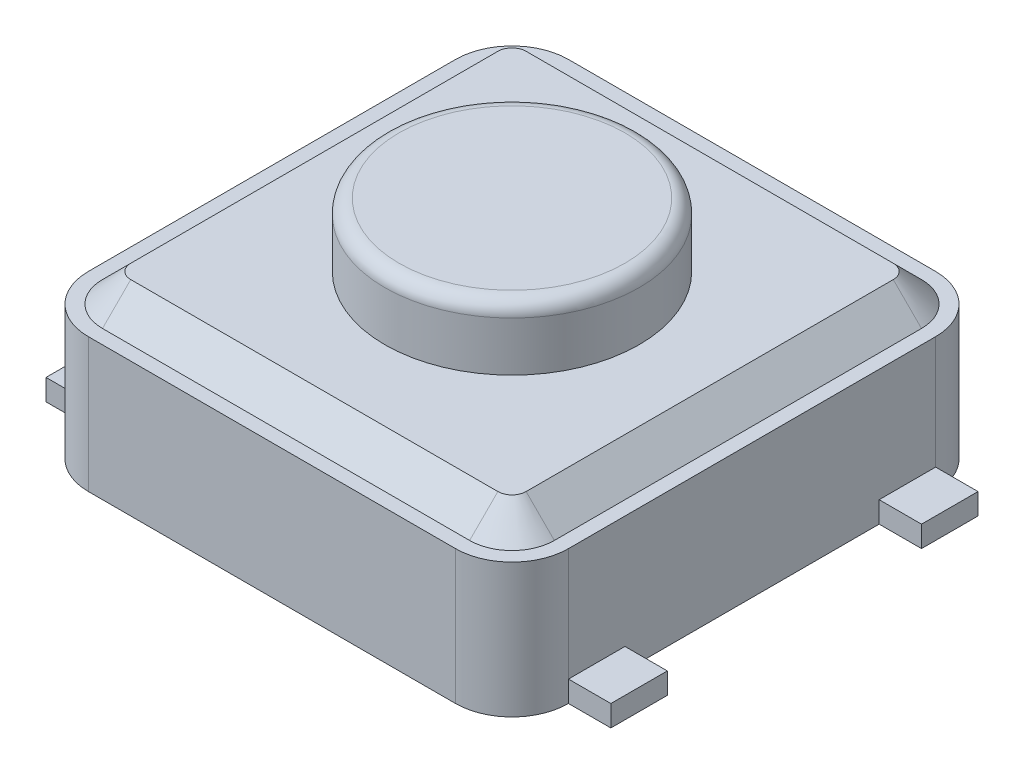
ISO-10303-21;
HEADER;
FILE_DESCRIPTION(('STEP AP214'),'2;1');
FILE_NAME('part.step','',(''),(''),'','','');
FILE_SCHEMA(('AUTOMOTIVE_DESIGN { 1 0 10303 214 1 1 1 1 }'));
ENDSEC;
DATA;
#1=APPLICATION_CONTEXT('core data for automotive mechanical design processes');
#2=APPLICATION_PROTOCOL_DEFINITION('international standard','automotive_design',2000,#1);
#3=PRODUCT_CONTEXT('',#1,'mechanical');
#4=PRODUCT('Part','Part','',(#3));
#5=PRODUCT_RELATED_PRODUCT_CATEGORY('part','',(#4));
#6=PRODUCT_DEFINITION_FORMATION('','',#4);
#7=PRODUCT_DEFINITION_CONTEXT('part definition',#1,'design');
#8=PRODUCT_DEFINITION('design','',#6,#7);
#9=PRODUCT_DEFINITION_SHAPE('','',#8);
#10=(LENGTH_UNIT() NAMED_UNIT(*) SI_UNIT(.MILLI.,.METRE.));
#11=(NAMED_UNIT(*) PLANE_ANGLE_UNIT() SI_UNIT($,.RADIAN.));
#12=(NAMED_UNIT(*) SI_UNIT($,.STERADIAN.) SOLID_ANGLE_UNIT());
#13=UNCERTAINTY_MEASURE_WITH_UNIT(LENGTH_MEASURE(1.E-05),#10,'distance_accuracy_value','');
#14=(GEOMETRIC_REPRESENTATION_CONTEXT(3) GLOBAL_UNCERTAINTY_ASSIGNED_CONTEXT((#13)) GLOBAL_UNIT_ASSIGNED_CONTEXT((#10,
#11,#12)) REPRESENTATION_CONTEXT('',''));
#15=CARTESIAN_POINT('',(0.,0.,0.));
#16=DIRECTION('',(0.,0.,1.));
#17=DIRECTION('',(1.,0.,0.));
#18=AXIS2_PLACEMENT_3D('',#15,#16,#17);
#19=CARTESIAN_POINT('',(-1.7,1.15,0.));
#20=DIRECTION('',(1.,0.,0.));
#21=DIRECTION('',(0.,0.,-1.));
#22=AXIS2_PLACEMENT_3D('',#19,#20,#21);
#23=PLANE('',#22);
#24=DIRECTION('',(0.,0.,1.));
#25=VECTOR('',#24,1.);
#26=CARTESIAN_POINT('',(-1.7,0.95,-1.7));
#27=LINE('',#26,#25);
#28=CARTESIAN_POINT('',(-1.7,0.95,-1.3));
#29=VERTEX_POINT('',#28);
#30=CARTESIAN_POINT('',(-1.7,0.95,1.3));
#31=VERTEX_POINT('',#30);
#32=EDGE_CURVE('E421',#29,#31,#27,.T.);
#33=ORIENTED_EDGE('',*,*,#32,.F.);
#34=DIRECTION('',(0.,-1.,0.));
#35=VECTOR('',#34,1.);
#36=CARTESIAN_POINT('',(-1.7,1.15,-1.3));
#37=LINE('',#36,#35);
#38=CARTESIAN_POINT('',(-1.7,0.15,-1.3));
#39=VERTEX_POINT('',#38);
#40=EDGE_CURVE('E466',#29,#39,#37,.T.);
#41=ORIENTED_EDGE('',*,*,#40,.T.);
#42=DIRECTION('',(0.,0.,1.));
#43=VECTOR('',#42,1.);
#44=CARTESIAN_POINT('',(-1.7,0.15,-0.9));
#45=LINE('',#44,#43);
#46=CARTESIAN_POINT('',(-1.7,0.15,-0.9));
#47=VERTEX_POINT('',#46);
#48=EDGE_CURVE('E429',#39,#47,#45,.T.);
#49=ORIENTED_EDGE('',*,*,#48,.T.);
#50=DIRECTION('',(0.,-1.,0.));
#51=VECTOR('',#50,1.);
#52=CARTESIAN_POINT('',(-1.7,0.15,-0.9));
#53=LINE('',#52,#51);
#54=CARTESIAN_POINT('',(-1.7,0.,-0.9));
#55=VERTEX_POINT('',#54);
#56=EDGE_CURVE('E442',#47,#55,#53,.T.);
#57=ORIENTED_EDGE('',*,*,#56,.T.);
#58=DIRECTION('',(0.,0.,1.));
#59=VECTOR('',#58,1.);
#60=CARTESIAN_POINT('',(-1.7,0.,0.));
#61=LINE('',#60,#59);
#62=CARTESIAN_POINT('',(-1.7,0.,0.9));
#63=VERTEX_POINT('',#62);
#64=EDGE_CURVE('E464',#55,#63,#61,.T.);
#65=ORIENTED_EDGE('',*,*,#64,.T.);
#66=DIRECTION('',(0.,-1.,0.));
#67=VECTOR('',#66,1.);
#68=CARTESIAN_POINT('',(-1.7,0.15,0.9));
#69=LINE('',#68,#67);
#70=CARTESIAN_POINT('',(-1.7,0.15,0.9));
#71=VERTEX_POINT('',#70);
#72=EDGE_CURVE('E317',#71,#63,#69,.T.);
#73=ORIENTED_EDGE('',*,*,#72,.F.);
#74=DIRECTION('',(0.,0.,-1.));
#75=VECTOR('',#74,1.);
#76=CARTESIAN_POINT('',(-1.7,0.15,0.9));
#77=LINE('',#76,#75);
#78=CARTESIAN_POINT('',(-1.7,0.15,1.3));
#79=VERTEX_POINT('',#78);
#80=EDGE_CURVE('E307',#79,#71,#77,.T.);
#81=ORIENTED_EDGE('',*,*,#80,.F.);
#82=DIRECTION('',(0.,-1.,0.));
#83=VECTOR('',#82,1.);
#84=CARTESIAN_POINT('',(-1.7,1.15,1.3));
#85=LINE('',#84,#83);
#86=EDGE_CURVE('E336',#31,#79,#85,.T.);
#87=ORIENTED_EDGE('',*,*,#86,.F.);
#88=EDGE_LOOP('',(#33,#41,#49,#57,#65,#73,#81,#87));
#89=FACE_BOUND('',#88,.T.);
#90=ADVANCED_FACE('F38',(#89),#23,.F.);
#91=CARTESIAN_POINT('',(0.,1.15,-1.7));
#92=DIRECTION('',(0.,0.,1.));
#93=DIRECTION('',(1.,0.,0.));
#94=AXIS2_PLACEMENT_3D('',#91,#92,#93);
#95=PLANE('',#94);
#96=DIRECTION('',(-1.,0.,0.));
#97=VECTOR('',#96,1.);
#98=CARTESIAN_POINT('',(0.,0.,-1.7));
#99=LINE('',#98,#97);
#100=CARTESIAN_POINT('',(1.3,0.,-1.7));
#101=VERTEX_POINT('',#100);
#102=CARTESIAN_POINT('',(-1.3,0.,-1.7));
#103=VERTEX_POINT('',#102);
#104=EDGE_CURVE('E461',#101,#103,#99,.T.);
#105=ORIENTED_EDGE('',*,*,#104,.T.);
#106=DIRECTION('',(0.,-1.,0.));
#107=VECTOR('',#106,1.);
#108=CARTESIAN_POINT('',(-1.3,1.15,-1.7));
#109=LINE('',#108,#107);
#110=CARTESIAN_POINT('',(-1.3,0.95,-1.7));
#111=VERTEX_POINT('',#110);
#112=EDGE_CURVE('E471',#103,#111,#109,.F.);
#113=ORIENTED_EDGE('',*,*,#112,.T.);
#114=DIRECTION('',(-1.,0.,0.));
#115=VECTOR('',#114,1.);
#116=CARTESIAN_POINT('',(0.,0.95,-1.7));
#117=LINE('',#116,#115);
#118=CARTESIAN_POINT('',(1.3,0.95,-1.7));
#119=VERTEX_POINT('',#118);
#120=EDGE_CURVE('E418',#119,#111,#117,.T.);
#121=ORIENTED_EDGE('',*,*,#120,.F.);
#122=DIRECTION('',(0.,-1.,0.));
#123=VECTOR('',#122,1.);
#124=CARTESIAN_POINT('',(1.3,1.15,-1.7));
#125=LINE('',#124,#123);
#126=EDGE_CURVE('E401',#101,#119,#125,.F.);
#127=ORIENTED_EDGE('',*,*,#126,.F.);
#128=EDGE_LOOP('',(#105,#113,#121,#127));
#129=FACE_BOUND('',#128,.T.);
#130=ADVANCED_FACE('F502',(#129),#95,.F.);
#131=CARTESIAN_POINT('',(0.,1.15,0.));
#132=DIRECTION('',(0.,1.,0.));
#133=DIRECTION('',(0.,0.,1.));
#134=AXIS2_PLACEMENT_3D('',#131,#132,#133);
#135=PLANE('',#134);
#136=CARTESIAN_POINT('',(0.,1.15,0.));
#137=DIRECTION('',(0.,1.,0.));
#138=DIRECTION('',(0.,0.,1.));
#139=AXIS2_PLACEMENT_3D('',#136,#137,#138);
#140=CIRCLE('',#139,0.9);
#141=CARTESIAN_POINT('',(0.,1.15,0.9));
#142=VERTEX_POINT('',#141);
#143=EDGE_CURVE('E452',#142,#142,#140,.T.);
#144=ORIENTED_EDGE('',*,*,#143,.F.);
#145=EDGE_LOOP('',(#144));
#146=FACE_BOUND('',#145,.T.);
#147=DIRECTION('',(1.,0.,0.));
#148=VECTOR('',#147,1.);
#149=CARTESIAN_POINT('',(0.,1.15,-1.4));
#150=LINE('',#149,#148);
#151=CARTESIAN_POINT('',(-1.3,1.15,-1.4));
#152=VERTEX_POINT('',#151);
#153=CARTESIAN_POINT('',(1.3,1.15,-1.4));
#154=VERTEX_POINT('',#153);
#155=EDGE_CURVE('E422',#152,#154,#150,.T.);
#156=ORIENTED_EDGE('',*,*,#155,.F.);
#157=CARTESIAN_POINT('',(-1.3,1.15,-1.3));
#158=DIRECTION('',(0.,1.,0.));
#159=DIRECTION('',(0.,0.,1.));
#160=AXIS2_PLACEMENT_3D('',#157,#158,#159);
#161=CIRCLE('',#160,0.1);
#162=CARTESIAN_POINT('',(-1.4,1.15,-1.3));
#163=VERTEX_POINT('',#162);
#164=EDGE_CURVE('E475',#152,#163,#161,.T.);
#165=ORIENTED_EDGE('',*,*,#164,.T.);
#166=DIRECTION('',(0.,0.,-1.));
#167=VECTOR('',#166,1.);
#168=CARTESIAN_POINT('',(-1.4,1.15,-1.4));
#169=LINE('',#168,#167);
#170=CARTESIAN_POINT('',(-1.4,1.15,1.3));
#171=VERTEX_POINT('',#170);
#172=EDGE_CURVE('E425',#171,#163,#169,.T.);
#173=ORIENTED_EDGE('',*,*,#172,.F.);
#174=CARTESIAN_POINT('',(-1.3,1.15,1.3));
#175=DIRECTION('',(0.,-1.,0.));
#176=DIRECTION('',(0.,0.,-1.));
#177=AXIS2_PLACEMENT_3D('',#174,#175,#176);
#178=CIRCLE('',#177,0.1);
#179=CARTESIAN_POINT('',(-1.3,1.15,1.4));
#180=VERTEX_POINT('',#179);
#181=EDGE_CURVE('E347',#180,#171,#178,.T.);
#182=ORIENTED_EDGE('',*,*,#181,.F.);
#183=DIRECTION('',(1.,0.,0.));
#184=VECTOR('',#183,1.);
#185=CARTESIAN_POINT('',(0.,1.15,1.4));
#186=LINE('',#185,#184);
#187=CARTESIAN_POINT('',(1.3,1.15,1.4));
#188=VERTEX_POINT('',#187);
#189=EDGE_CURVE('E303',#180,#188,#186,.T.);
#190=ORIENTED_EDGE('',*,*,#189,.T.);
#191=CARTESIAN_POINT('',(1.3,1.15,1.3));
#192=DIRECTION('',(0.,1.,0.));
#193=DIRECTION('',(0.,0.,-1.));
#194=AXIS2_PLACEMENT_3D('',#191,#192,#193);
#195=CIRCLE('',#194,0.1);
#196=CARTESIAN_POINT('',(1.4,1.15,1.3));
#197=VERTEX_POINT('',#196);
#198=EDGE_CURVE('E288',#188,#197,#195,.T.);
#199=ORIENTED_EDGE('',*,*,#198,.T.);
#200=DIRECTION('',(0.,0.,-1.));
#201=VECTOR('',#200,1.);
#202=CARTESIAN_POINT('',(1.4,1.15,-1.4));
#203=LINE('',#202,#201);
#204=CARTESIAN_POINT('',(1.4,1.15,-1.3));
#205=VERTEX_POINT('',#204);
#206=EDGE_CURVE('E363',#197,#205,#203,.T.);
#207=ORIENTED_EDGE('',*,*,#206,.T.);
#208=CARTESIAN_POINT('',(1.3,1.15,-1.3));
#209=DIRECTION('',(0.,-1.,0.));
#210=DIRECTION('',(0.,0.,1.));
#211=AXIS2_PLACEMENT_3D('',#208,#209,#210);
#212=CIRCLE('',#211,0.1);
#213=EDGE_CURVE('E406',#154,#205,#212,.T.);
#214=ORIENTED_EDGE('',*,*,#213,.F.);
#215=EDGE_LOOP('',(#156,#165,#173,#182,#190,#199,#207,#214));
#216=FACE_BOUND('',#215,.T.);
#217=ADVANCED_FACE('F508',(#146,#216),#135,.T.);
#218=CARTESIAN_POINT('',(0.,0.,0.));
#219=DIRECTION('',(0.,1.,0.));
#220=DIRECTION('',(0.,0.,1.));
#221=AXIS2_PLACEMENT_3D('',#218,#219,#220);
#222=PLANE('',#221);
#223=DIRECTION('',(1.,0.,0.));
#224=VECTOR('',#223,1.);
#225=CARTESIAN_POINT('',(-1.7,0.,-1.3));
#226=LINE('',#225,#224);
#227=CARTESIAN_POINT('',(-2.,0.,-1.3));
#228=VERTEX_POINT('',#227);
#229=CARTESIAN_POINT('',(-1.7,0.,-1.3));
#230=VERTEX_POINT('',#229);
#231=EDGE_CURVE('E433',#228,#230,#226,.T.);
#232=ORIENTED_EDGE('',*,*,#231,.T.);
#233=CARTESIAN_POINT('',(-1.3,0.,-1.3));
#234=DIRECTION('',(0.,1.,0.));
#235=DIRECTION('',(0.,0.,1.));
#236=AXIS2_PLACEMENT_3D('',#233,#234,#235);
#237=CIRCLE('',#236,0.4);
#238=EDGE_CURVE('E469',#230,#103,#237,.F.);
#239=ORIENTED_EDGE('',*,*,#238,.T.);
#240=ORIENTED_EDGE('',*,*,#104,.F.);
#241=CARTESIAN_POINT('',(1.3,0.,-1.3));
#242=DIRECTION('',(0.,-1.,0.));
#243=DIRECTION('',(0.,0.,1.));
#244=AXIS2_PLACEMENT_3D('',#241,#242,#243);
#245=CIRCLE('',#244,0.4);
#246=CARTESIAN_POINT('',(1.7,0.,-1.3));
#247=VERTEX_POINT('',#246);
#248=EDGE_CURVE('E398',#247,#101,#245,.F.);
#249=ORIENTED_EDGE('',*,*,#248,.F.);
#250=DIRECTION('',(-1.,0.,0.));
#251=VECTOR('',#250,1.);
#252=CARTESIAN_POINT('',(1.7,0.,-1.3));
#253=LINE('',#252,#251);
#254=CARTESIAN_POINT('',(2.,0.,-1.3));
#255=VERTEX_POINT('',#254);
#256=EDGE_CURVE('E371',#255,#247,#253,.T.);
#257=ORIENTED_EDGE('',*,*,#256,.F.);
#258=DIRECTION('',(0.,0.,-1.));
#259=VECTOR('',#258,1.);
#260=CARTESIAN_POINT('',(2.,0.,-0.9));
#261=LINE('',#260,#259);
#262=CARTESIAN_POINT('',(2.,0.,-0.9));
#263=VERTEX_POINT('',#262);
#264=EDGE_CURVE('E380',#263,#255,#261,.T.);
#265=ORIENTED_EDGE('',*,*,#264,.F.);
#266=DIRECTION('',(1.,0.,0.));
#267=VECTOR('',#266,1.);
#268=CARTESIAN_POINT('',(1.7,0.,-0.9));
#269=LINE('',#268,#267);
#270=CARTESIAN_POINT('',(1.7,0.,-0.9));
#271=VERTEX_POINT('',#270);
#272=EDGE_CURVE('E362',#271,#263,#269,.T.);
#273=ORIENTED_EDGE('',*,*,#272,.F.);
#274=DIRECTION('',(0.,0.,1.));
#275=VECTOR('',#274,1.);
#276=CARTESIAN_POINT('',(1.7,0.,0.));
#277=LINE('',#276,#275);
#278=CARTESIAN_POINT('',(1.7,0.,0.9));
#279=VERTEX_POINT('',#278);
#280=EDGE_CURVE('E387',#271,#279,#277,.T.);
#281=ORIENTED_EDGE('',*,*,#280,.T.);
#282=DIRECTION('',(1.,0.,0.));
#283=VECTOR('',#282,1.);
#284=CARTESIAN_POINT('',(1.7,0.,0.9));
#285=LINE('',#284,#283);
#286=CARTESIAN_POINT('',(2.,0.,0.9));
#287=VERTEX_POINT('',#286);
#288=EDGE_CURVE('E252',#279,#287,#285,.T.);
#289=ORIENTED_EDGE('',*,*,#288,.T.);
#290=DIRECTION('',(0.,0.,1.));
#291=VECTOR('',#290,1.);
#292=CARTESIAN_POINT('',(2.,0.,0.9));
#293=LINE('',#292,#291);
#294=CARTESIAN_POINT('',(2.,0.,1.3));
#295=VERTEX_POINT('',#294);
#296=EDGE_CURVE('E264',#287,#295,#293,.T.);
#297=ORIENTED_EDGE('',*,*,#296,.T.);
#298=DIRECTION('',(-1.,0.,0.));
#299=VECTOR('',#298,1.);
#300=CARTESIAN_POINT('',(1.7,0.,1.3));
#301=LINE('',#300,#299);
#302=CARTESIAN_POINT('',(1.7,0.,1.3));
#303=VERTEX_POINT('',#302);
#304=EDGE_CURVE('E261',#295,#303,#301,.T.);
#305=ORIENTED_EDGE('',*,*,#304,.T.);
#306=CARTESIAN_POINT('',(1.3,0.,1.3));
#307=DIRECTION('',(0.,1.,0.));
#308=DIRECTION('',(0.,0.,-1.));
#309=AXIS2_PLACEMENT_3D('',#306,#307,#308);
#310=CIRCLE('',#309,0.4);
#311=CARTESIAN_POINT('',(1.3,0.,1.7));
#312=VERTEX_POINT('',#311);
#313=EDGE_CURVE('E280',#303,#312,#310,.F.);
#314=ORIENTED_EDGE('',*,*,#313,.T.);
#315=DIRECTION('',(-1.,0.,0.));
#316=VECTOR('',#315,1.);
#317=CARTESIAN_POINT('',(0.,0.,1.7));
#318=LINE('',#317,#316);
#319=CARTESIAN_POINT('',(-1.3,0.,1.7));
#320=VERTEX_POINT('',#319);
#321=EDGE_CURVE('E327',#312,#320,#318,.T.);
#322=ORIENTED_EDGE('',*,*,#321,.T.);
#323=CARTESIAN_POINT('',(-1.3,0.,1.3));
#324=DIRECTION('',(0.,-1.,0.));
#325=DIRECTION('',(0.,0.,-1.));
#326=AXIS2_PLACEMENT_3D('',#323,#324,#325);
#327=CIRCLE('',#326,0.4);
#328=CARTESIAN_POINT('',(-1.7,0.,1.3));
#329=VERTEX_POINT('',#328);
#330=EDGE_CURVE('E339',#329,#320,#327,.F.);
#331=ORIENTED_EDGE('',*,*,#330,.F.);
#332=DIRECTION('',(1.,0.,0.));
#333=VECTOR('',#332,1.);
#334=CARTESIAN_POINT('',(-1.7,0.,1.3));
#335=LINE('',#334,#333);
#336=CARTESIAN_POINT('',(-2.,0.,1.3));
#337=VERTEX_POINT('',#336);
#338=EDGE_CURVE('E311',#337,#329,#335,.T.);
#339=ORIENTED_EDGE('',*,*,#338,.F.);
#340=DIRECTION('',(0.,0.,1.));
#341=VECTOR('',#340,1.);
#342=CARTESIAN_POINT('',(-2.,0.,0.9));
#343=LINE('',#342,#341);
#344=CARTESIAN_POINT('',(-2.,0.,0.9));
#345=VERTEX_POINT('',#344);
#346=EDGE_CURVE('E320',#345,#337,#343,.T.);
#347=ORIENTED_EDGE('',*,*,#346,.F.);
#348=DIRECTION('',(-1.,0.,0.));
#349=VECTOR('',#348,1.);
#350=CARTESIAN_POINT('',(-1.7,0.,0.9));
#351=LINE('',#350,#349);
#352=EDGE_CURVE('E302',#63,#345,#351,.T.);
#353=ORIENTED_EDGE('',*,*,#352,.F.);
#354=ORIENTED_EDGE('',*,*,#64,.F.);
#355=DIRECTION('',(-1.,0.,0.));
#356=VECTOR('',#355,1.);
#357=CARTESIAN_POINT('',(-1.7,0.,-0.9));
#358=LINE('',#357,#356);
#359=CARTESIAN_POINT('',(-2.,0.,-0.9));
#360=VERTEX_POINT('',#359);
#361=EDGE_CURVE('E424',#55,#360,#358,.T.);
#362=ORIENTED_EDGE('',*,*,#361,.T.);
#363=DIRECTION('',(0.,0.,-1.));
#364=VECTOR('',#363,1.);
#365=CARTESIAN_POINT('',(-2.,0.,-0.9));
#366=LINE('',#365,#364);
#367=EDGE_CURVE('E445',#360,#228,#366,.T.);
#368=ORIENTED_EDGE('',*,*,#367,.T.);
#369=EDGE_LOOP('',(#232,#239,#240,#249,#257,#265,#273,#281,#289,#297,#305,#314,#322,#331,#339,
#347,#353,#354,#362,#368));
#370=FACE_BOUND('',#369,.T.);
#371=ADVANCED_FACE('F513',(#370),#222,.F.);
#372=CARTESIAN_POINT('',(0.,1.6,0.));
#373=DIRECTION('',(0.,-1.,0.));
#374=DIRECTION('',(0.,0.,-1.));
#375=AXIS2_PLACEMENT_3D('',#372,#373,#374);
#376=CYLINDRICAL_SURFACE('',#375,0.9);
#377=ORIENTED_EDGE('',*,*,#143,.T.);
#378=EDGE_LOOP('',(#377));
#379=FACE_BOUND('',#378,.T.);
#380=CARTESIAN_POINT('',(0.,1.5,0.));
#381=DIRECTION('',(0.,1.,0.));
#382=DIRECTION('',(0.,0.,1.));
#383=AXIS2_PLACEMENT_3D('',#380,#381,#382);
#384=CIRCLE('',#383,0.9);
#385=CARTESIAN_POINT('',(0.,1.5,0.9));
#386=VERTEX_POINT('',#385);
#387=EDGE_CURVE('E11',#386,#386,#384,.F.);
#388=ORIENTED_EDGE('',*,*,#387,.T.);
#389=EDGE_LOOP('',(#388));
#390=FACE_BOUND('',#389,.T.);
#391=ADVANCED_FACE('F610',(#379,#390),#376,.T.);
#392=CARTESIAN_POINT('',(0.,1.6,0.));
#393=DIRECTION('',(0.,1.,0.));
#394=DIRECTION('',(0.,0.,1.));
#395=AXIS2_PLACEMENT_3D('',#392,#393,#394);
#396=PLANE('',#395);
#397=CARTESIAN_POINT('',(0.,1.6,0.));
#398=DIRECTION('',(0.,1.,0.));
#399=DIRECTION('',(0.,0.,1.));
#400=AXIS2_PLACEMENT_3D('',#397,#398,#399);
#401=CIRCLE('',#400,0.8);
#402=CARTESIAN_POINT('',(0.,1.6,0.8));
#403=VERTEX_POINT('',#402);
#404=EDGE_CURVE('E46',#403,#403,#401,.T.);
#405=ORIENTED_EDGE('',*,*,#404,.T.);
#406=EDGE_LOOP('',(#405));
#407=FACE_BOUND('',#406,.T.);
#408=ADVANCED_FACE('F487',(#407),#396,.T.);
#409=CARTESIAN_POINT('',(-1.7,0.15,-1.3));
#410=DIRECTION('',(0.,0.,-1.));
#411=DIRECTION('',(-1.,0.,0.));
#412=AXIS2_PLACEMENT_3D('',#409,#410,#411);
#413=PLANE('',#412);
#414=ORIENTED_EDGE('',*,*,#231,.F.);
#415=DIRECTION('',(0.,-1.,0.));
#416=VECTOR('',#415,1.);
#417=CARTESIAN_POINT('',(-2.,0.15,-1.3));
#418=LINE('',#417,#416);
#419=CARTESIAN_POINT('',(-2.,0.15,-1.3));
#420=VERTEX_POINT('',#419);
#421=EDGE_CURVE('E453',#420,#228,#418,.T.);
#422=ORIENTED_EDGE('',*,*,#421,.F.);
#423=DIRECTION('',(1.,0.,0.));
#424=VECTOR('',#423,1.);
#425=CARTESIAN_POINT('',(-1.7,0.15,-1.3));
#426=LINE('',#425,#424);
#427=EDGE_CURVE('E439',#420,#39,#426,.T.);
#428=ORIENTED_EDGE('',*,*,#427,.T.);
#429=DIRECTION('',(0.,-1.,0.));
#430=VECTOR('',#429,1.);
#431=CARTESIAN_POINT('',(-1.7,0.15,-1.3));
#432=LINE('',#431,#430);
#433=EDGE_CURVE('E450',#39,#230,#432,.T.);
#434=ORIENTED_EDGE('',*,*,#433,.T.);
#435=EDGE_LOOP('',(#414,#422,#428,#434));
#436=FACE_BOUND('',#435,.T.);
#437=ADVANCED_FACE('F597',(#436),#413,.T.);
#438=CARTESIAN_POINT('',(-2.,0.15,-0.9));
#439=DIRECTION('',(-1.,0.,0.));
#440=DIRECTION('',(0.,0.,1.));
#441=AXIS2_PLACEMENT_3D('',#438,#439,#440);
#442=PLANE('',#441);
#443=ORIENTED_EDGE('',*,*,#367,.F.);
#444=DIRECTION('',(0.,-1.,0.));
#445=VECTOR('',#444,1.);
#446=CARTESIAN_POINT('',(-2.,0.15,-0.9));
#447=LINE('',#446,#445);
#448=CARTESIAN_POINT('',(-2.,0.15,-0.9));
#449=VERTEX_POINT('',#448);
#450=EDGE_CURVE('E455',#449,#360,#447,.T.);
#451=ORIENTED_EDGE('',*,*,#450,.F.);
#452=DIRECTION('',(0.,0.,-1.));
#453=VECTOR('',#452,1.);
#454=CARTESIAN_POINT('',(-2.,0.15,-0.9));
#455=LINE('',#454,#453);
#456=EDGE_CURVE('E436',#449,#420,#455,.T.);
#457=ORIENTED_EDGE('',*,*,#456,.T.);
#458=ORIENTED_EDGE('',*,*,#421,.T.);
#459=EDGE_LOOP('',(#443,#451,#457,#458));
#460=FACE_BOUND('',#459,.T.);
#461=ADVANCED_FACE('F600',(#460),#442,.T.);
#462=CARTESIAN_POINT('',(-1.7,0.15,-0.9));
#463=DIRECTION('',(0.,0.,1.));
#464=DIRECTION('',(1.,0.,0.));
#465=AXIS2_PLACEMENT_3D('',#462,#463,#464);
#466=PLANE('',#465);
#467=ORIENTED_EDGE('',*,*,#361,.F.);
#468=ORIENTED_EDGE('',*,*,#56,.F.);
#469=DIRECTION('',(-1.,0.,0.));
#470=VECTOR('',#469,1.);
#471=CARTESIAN_POINT('',(-1.7,0.15,-0.9));
#472=LINE('',#471,#470);
#473=EDGE_CURVE('E432',#47,#449,#472,.T.);
#474=ORIENTED_EDGE('',*,*,#473,.T.);
#475=ORIENTED_EDGE('',*,*,#450,.T.);
#476=EDGE_LOOP('',(#467,#468,#474,#475));
#477=FACE_BOUND('',#476,.T.);
#478=ADVANCED_FACE('F595',(#477),#466,.T.);
#479=CARTESIAN_POINT('',(0.,0.15,0.));
#480=DIRECTION('',(0.,1.,0.));
#481=DIRECTION('',(0.,0.,1.));
#482=AXIS2_PLACEMENT_3D('',#479,#480,#481);
#483=PLANE('',#482);
#484=ORIENTED_EDGE('',*,*,#48,.F.);
#485=ORIENTED_EDGE('',*,*,#427,.F.);
#486=ORIENTED_EDGE('',*,*,#456,.F.);
#487=ORIENTED_EDGE('',*,*,#473,.F.);
#488=EDGE_LOOP('',(#484,#485,#486,#487));
#489=FACE_BOUND('',#488,.T.);
#490=ADVANCED_FACE('F592',(#489),#483,.T.);
#491=CARTESIAN_POINT('',(0.,0.95,0.));
#492=DIRECTION('',(0.,1.,0.));
#493=DIRECTION('',(0.,0.,1.));
#494=AXIS2_PLACEMENT_3D('',#491,#492,#493);
#495=PLANE('',#494);
#496=CARTESIAN_POINT('',(-1.3,0.95,1.3));
#497=DIRECTION('',(0.,-1.,0.));
#498=DIRECTION('',(0.,0.,-1.));
#499=AXIS2_PLACEMENT_3D('',#496,#497,#498);
#500=CIRCLE('',#499,0.300000000000001);
#501=CARTESIAN_POINT('',(-1.6,0.95,1.3));
#502=VERTEX_POINT('',#501);
#503=CARTESIAN_POINT('',(-1.3,0.95,1.6));
#504=VERTEX_POINT('',#503);
#505=EDGE_CURVE('E353',#502,#504,#500,.F.);
#506=ORIENTED_EDGE('',*,*,#505,.F.);
#507=DIRECTION('',(0.,0.,-1.));
#508=VECTOR('',#507,1.);
#509=CARTESIAN_POINT('',(-1.6,0.95,0.));
#510=LINE('',#509,#508);
#511=CARTESIAN_POINT('',(-1.6,0.95,-1.3));
#512=VERTEX_POINT('',#511);
#513=EDGE_CURVE('E480',#502,#512,#510,.T.);
#514=ORIENTED_EDGE('',*,*,#513,.T.);
#515=CARTESIAN_POINT('',(-1.3,0.95,-1.3));
#516=DIRECTION('',(0.,1.,0.));
#517=DIRECTION('',(0.,0.,1.));
#518=AXIS2_PLACEMENT_3D('',#515,#516,#517);
#519=CIRCLE('',#518,0.300000000000001);
#520=CARTESIAN_POINT('',(-1.3,0.95,-1.6));
#521=VERTEX_POINT('',#520);
#522=EDGE_CURVE('E60',#512,#521,#519,.F.);
#523=ORIENTED_EDGE('',*,*,#522,.T.);
#524=DIRECTION('',(1.,0.,0.));
#525=VECTOR('',#524,1.);
#526=CARTESIAN_POINT('',(0.,0.95,-1.6));
#527=LINE('',#526,#525);
#528=CARTESIAN_POINT('',(1.3,0.95,-1.6));
#529=VERTEX_POINT('',#528);
#530=EDGE_CURVE('E477',#521,#529,#527,.T.);
#531=ORIENTED_EDGE('',*,*,#530,.T.);
#532=CARTESIAN_POINT('',(1.3,0.95,-1.3));
#533=DIRECTION('',(0.,-1.,0.));
#534=DIRECTION('',(0.,0.,1.));
#535=AXIS2_PLACEMENT_3D('',#532,#533,#534);
#536=CIRCLE('',#535,0.300000000000001);
#537=CARTESIAN_POINT('',(1.6,0.95,-1.3));
#538=VERTEX_POINT('',#537);
#539=EDGE_CURVE('E409',#538,#529,#536,.F.);
#540=ORIENTED_EDGE('',*,*,#539,.F.);
#541=DIRECTION('',(0.,0.,-1.));
#542=VECTOR('',#541,1.);
#543=CARTESIAN_POINT('',(1.6,0.95,0.));
#544=LINE('',#543,#542);
#545=CARTESIAN_POINT('',(1.6,0.95,1.3));
#546=VERTEX_POINT('',#545);
#547=EDGE_CURVE('E412',#546,#538,#544,.T.);
#548=ORIENTED_EDGE('',*,*,#547,.F.);
#549=CARTESIAN_POINT('',(1.3,0.95,1.3));
#550=DIRECTION('',(0.,1.,0.));
#551=DIRECTION('',(0.,0.,-1.));
#552=AXIS2_PLACEMENT_3D('',#549,#550,#551);
#553=CIRCLE('',#552,0.300000000000001);
#554=CARTESIAN_POINT('',(1.3,0.95,1.6));
#555=VERTEX_POINT('',#554);
#556=EDGE_CURVE('E291',#546,#555,#553,.F.);
#557=ORIENTED_EDGE('',*,*,#556,.T.);
#558=DIRECTION('',(1.,0.,0.));
#559=VECTOR('',#558,1.);
#560=CARTESIAN_POINT('',(0.,0.95,1.6));
#561=LINE('',#560,#559);
#562=EDGE_CURVE('E350',#504,#555,#561,.T.);
#563=ORIENTED_EDGE('',*,*,#562,.F.);
#564=EDGE_LOOP('',(#506,#514,#523,#531,#540,#548,#557,#563));
#565=FACE_BOUND('',#564,.T.);
#566=ORIENTED_EDGE('',*,*,#32,.T.);
#567=CARTESIAN_POINT('',(-1.3,0.95,1.3));
#568=DIRECTION('',(0.,-1.,0.));
#569=DIRECTION('',(0.,0.,-1.));
#570=AXIS2_PLACEMENT_3D('',#567,#568,#569);
#571=CIRCLE('',#570,0.4);
#572=CARTESIAN_POINT('',(-1.3,0.95,1.7));
#573=VERTEX_POINT('',#572);
#574=EDGE_CURVE('E344',#573,#31,#571,.T.);
#575=ORIENTED_EDGE('',*,*,#574,.F.);
#576=DIRECTION('',(-1.,0.,0.));
#577=VECTOR('',#576,1.);
#578=CARTESIAN_POINT('',(0.,0.95,1.7));
#579=LINE('',#578,#577);
#580=CARTESIAN_POINT('',(1.3,0.95,1.7));
#581=VERTEX_POINT('',#580);
#582=EDGE_CURVE('E299',#581,#573,#579,.T.);
#583=ORIENTED_EDGE('',*,*,#582,.F.);
#584=CARTESIAN_POINT('',(1.3,0.95,1.3));
#585=DIRECTION('',(0.,1.,0.));
#586=DIRECTION('',(0.,0.,-1.));
#587=AXIS2_PLACEMENT_3D('',#584,#585,#586);
#588=CIRCLE('',#587,0.4);
#589=CARTESIAN_POINT('',(1.7,0.95,1.3));
#590=VERTEX_POINT('',#589);
#591=EDGE_CURVE('E285',#581,#590,#588,.T.);
#592=ORIENTED_EDGE('',*,*,#591,.T.);
#593=DIRECTION('',(0.,0.,1.));
#594=VECTOR('',#593,1.);
#595=CARTESIAN_POINT('',(1.7,0.95,-1.7));
#596=LINE('',#595,#594);
#597=CARTESIAN_POINT('',(1.7,0.95,-1.3));
#598=VERTEX_POINT('',#597);
#599=EDGE_CURVE('E360',#598,#590,#596,.T.);
#600=ORIENTED_EDGE('',*,*,#599,.F.);
#601=CARTESIAN_POINT('',(1.3,0.95,-1.3));
#602=DIRECTION('',(0.,-1.,0.));
#603=DIRECTION('',(0.,0.,1.));
#604=AXIS2_PLACEMENT_3D('',#601,#602,#603);
#605=CIRCLE('',#604,0.4);
#606=EDGE_CURVE('E404',#119,#598,#605,.T.);
#607=ORIENTED_EDGE('',*,*,#606,.F.);
#608=ORIENTED_EDGE('',*,*,#120,.T.);
#609=CARTESIAN_POINT('',(-1.3,0.95,-1.3));
#610=DIRECTION('',(0.,1.,0.));
#611=DIRECTION('',(0.,0.,1.));
#612=AXIS2_PLACEMENT_3D('',#609,#610,#611);
#613=CIRCLE('',#612,0.4);
#614=EDGE_CURVE('E473',#111,#29,#613,.T.);
#615=ORIENTED_EDGE('',*,*,#614,.T.);
#616=EDGE_LOOP('',(#566,#575,#583,#592,#600,#607,#608,#615));
#617=FACE_BOUND('',#616,.T.);
#618=ADVANCED_FACE('F519',(#565,#617),#495,.T.);
#619=CARTESIAN_POINT('',(-1.3,1.15,-1.3));
#620=DIRECTION('',(0.,-1.,0.));
#621=DIRECTION('',(0.,0.,-1.));
#622=AXIS2_PLACEMENT_3D('',#619,#620,#621);
#623=CYLINDRICAL_SURFACE('',#622,0.4);
#624=ORIENTED_EDGE('',*,*,#614,.F.);
#625=ORIENTED_EDGE('',*,*,#112,.F.);
#626=ORIENTED_EDGE('',*,*,#238,.F.);
#627=ORIENTED_EDGE('',*,*,#433,.F.);
#628=ORIENTED_EDGE('',*,*,#40,.F.);
#629=EDGE_LOOP('',(#624,#625,#626,#627,#628));
#630=FACE_BOUND('',#629,.T.);
#631=ADVANCED_FACE('F516',(#630),#623,.T.);
#632=CARTESIAN_POINT('',(0.,0.95,-1.6));
#633=DIRECTION('',(0.,-0.707106781186552,0.707106781186544));
#634=DIRECTION('',(1.,0.,0.));
#635=AXIS2_PLACEMENT_3D('',#632,#633,#634);
#636=PLANE('',#635);
#637=ORIENTED_EDGE('',*,*,#155,.T.);
#638=DIRECTION('',(0.,-0.707106781186544,-0.707106781186552));
#639=VECTOR('',#638,1.);
#640=CARTESIAN_POINT('',(1.3,1.15,-1.4));
#641=LINE('',#640,#639);
#642=EDGE_CURVE('E366',#154,#529,#641,.T.);
#643=ORIENTED_EDGE('',*,*,#642,.T.);
#644=ORIENTED_EDGE('',*,*,#530,.F.);
#645=DIRECTION('',(0.,-0.707106781186544,-0.707106781186552));
#646=VECTOR('',#645,1.);
#647=CARTESIAN_POINT('',(-1.3,1.15,-1.4));
#648=LINE('',#647,#646);
#649=EDGE_CURVE('E427',#152,#521,#648,.T.);
#650=ORIENTED_EDGE('',*,*,#649,.F.);
#651=EDGE_LOOP('',(#637,#643,#644,#650));
#652=FACE_BOUND('',#651,.T.);
#653=ADVANCED_FACE('F518',(#652),#636,.F.);
#654=CARTESIAN_POINT('',(-1.3,0.95,-1.3));
#655=DIRECTION('',(0.,-1.,0.));
#656=DIRECTION('',(0.,0.,-1.));
#657=AXIS2_PLACEMENT_3D('',#654,#655,#656);
#658=CONICAL_SURFACE('',#657,0.300000000000001,0.785398163397454);
#659=ORIENTED_EDGE('',*,*,#649,.T.);
#660=ORIENTED_EDGE('',*,*,#522,.F.);
#661=DIRECTION('',(-0.707106781186552,-0.707106781186544,0.));
#662=VECTOR('',#661,1.);
#663=CARTESIAN_POINT('',(-1.4,1.15,-1.3));
#664=LINE('',#663,#662);
#665=EDGE_CURVE('E53',#163,#512,#664,.T.);
#666=ORIENTED_EDGE('',*,*,#665,.F.);
#667=ORIENTED_EDGE('',*,*,#164,.F.);
#668=EDGE_LOOP('',(#659,#660,#666,#667));
#669=FACE_BOUND('',#668,.T.);
#670=ADVANCED_FACE('F498',(#669),#658,.T.);
#671=CARTESIAN_POINT('',(-1.6,0.95,0.));
#672=DIRECTION('',(0.707106781186544,-0.707106781186552,0.));
#673=DIRECTION('',(0.,0.,-1.));
#674=AXIS2_PLACEMENT_3D('',#671,#672,#673);
#675=PLANE('',#674);
#676=ORIENTED_EDGE('',*,*,#513,.F.);
#677=DIRECTION('',(-0.707106781186552,-0.707106781186544,0.));
#678=VECTOR('',#677,1.);
#679=CARTESIAN_POINT('',(-1.4,1.15,1.3));
#680=LINE('',#679,#678);
#681=EDGE_CURVE('E294',#171,#502,#680,.T.);
#682=ORIENTED_EDGE('',*,*,#681,.F.);
#683=ORIENTED_EDGE('',*,*,#172,.T.);
#684=ORIENTED_EDGE('',*,*,#665,.T.);
#685=EDGE_LOOP('',(#676,#682,#683,#684));
#686=FACE_BOUND('',#685,.T.);
#687=ADVANCED_FACE('F490',(#686),#675,.F.);
#688=CARTESIAN_POINT('',(0.,1.5,0.));
#689=DIRECTION('',(0.,1.,0.));
#690=DIRECTION('',(0.,0.,1.));
#691=AXIS2_PLACEMENT_3D('',#688,#689,#690);
#692=TOROIDAL_SURFACE('',#691,0.8,0.1);
#693=ORIENTED_EDGE('',*,*,#387,.F.);
#694=EDGE_LOOP('',(#693));
#695=FACE_BOUND('',#694,.T.);
#696=ORIENTED_EDGE('',*,*,#404,.F.);
#697=EDGE_LOOP('',(#696));
#698=FACE_BOUND('',#697,.T.);
#699=ADVANCED_FACE('F40',(#695,#698),#692,.T.);
#700=CARTESIAN_POINT('',(1.7,1.15,0.));
#701=DIRECTION('',(-1.,0.,0.));
#702=DIRECTION('',(0.,0.,-1.));
#703=AXIS2_PLACEMENT_3D('',#700,#701,#702);
#704=PLANE('',#703);
#705=ORIENTED_EDGE('',*,*,#599,.T.);
#706=DIRECTION('',(0.,-1.,0.));
#707=VECTOR('',#706,1.);
#708=CARTESIAN_POINT('',(1.7,1.15,1.3));
#709=LINE('',#708,#707);
#710=CARTESIAN_POINT('',(1.7,0.15,1.3));
#711=VERTEX_POINT('',#710);
#712=EDGE_CURVE('E260',#590,#711,#709,.T.);
#713=ORIENTED_EDGE('',*,*,#712,.T.);
#714=DIRECTION('',(0.,0.,-1.));
#715=VECTOR('',#714,1.);
#716=CARTESIAN_POINT('',(1.7,0.15,0.9));
#717=LINE('',#716,#715);
#718=CARTESIAN_POINT('',(1.7,0.15,0.9));
#719=VERTEX_POINT('',#718);
#720=EDGE_CURVE('E241',#711,#719,#717,.T.);
#721=ORIENTED_EDGE('',*,*,#720,.T.);
#722=DIRECTION('',(0.,-1.,0.));
#723=VECTOR('',#722,1.);
#724=CARTESIAN_POINT('',(1.7,0.15,0.9));
#725=LINE('',#724,#723);
#726=EDGE_CURVE('E249',#719,#279,#725,.T.);
#727=ORIENTED_EDGE('',*,*,#726,.T.);
#728=ORIENTED_EDGE('',*,*,#280,.F.);
#729=DIRECTION('',(0.,-1.,0.));
#730=VECTOR('',#729,1.);
#731=CARTESIAN_POINT('',(1.7,0.15,-0.9));
#732=LINE('',#731,#730);
#733=CARTESIAN_POINT('',(1.7,0.15,-0.9));
#734=VERTEX_POINT('',#733);
#735=EDGE_CURVE('E377',#734,#271,#732,.T.);
#736=ORIENTED_EDGE('',*,*,#735,.F.);
#737=DIRECTION('',(0.,0.,1.));
#738=VECTOR('',#737,1.);
#739=CARTESIAN_POINT('',(1.7,0.15,-0.9));
#740=LINE('',#739,#738);
#741=CARTESIAN_POINT('',(1.7,0.15,-1.3));
#742=VERTEX_POINT('',#741);
#743=EDGE_CURVE('E367',#742,#734,#740,.T.);
#744=ORIENTED_EDGE('',*,*,#743,.F.);
#745=DIRECTION('',(0.,-1.,0.));
#746=VECTOR('',#745,1.);
#747=CARTESIAN_POINT('',(1.7,1.15,-1.3));
#748=LINE('',#747,#746);
#749=EDGE_CURVE('E395',#598,#742,#748,.T.);
#750=ORIENTED_EDGE('',*,*,#749,.F.);
#751=EDGE_LOOP('',(#705,#713,#721,#727,#728,#736,#744,#750));
#752=FACE_BOUND('',#751,.T.);
#753=ADVANCED_FACE('F258',(#752),#704,.F.);
#754=CARTESIAN_POINT('',(1.7,0.15,-1.3));
#755=DIRECTION('',(0.,0.,-1.));
#756=DIRECTION('',(1.,0.,0.));
#757=AXIS2_PLACEMENT_3D('',#754,#755,#756);
#758=PLANE('',#757);
#759=ORIENTED_EDGE('',*,*,#256,.T.);
#760=DIRECTION('',(0.,-1.,0.));
#761=VECTOR('',#760,1.);
#762=CARTESIAN_POINT('',(1.7,0.15,-1.3));
#763=LINE('',#762,#761);
#764=EDGE_CURVE('E385',#742,#247,#763,.T.);
#765=ORIENTED_EDGE('',*,*,#764,.F.);
#766=DIRECTION('',(-1.,0.,0.));
#767=VECTOR('',#766,1.);
#768=CARTESIAN_POINT('',(1.7,0.15,-1.3));
#769=LINE('',#768,#767);
#770=CARTESIAN_POINT('',(2.,0.15,-1.3));
#771=VERTEX_POINT('',#770);
#772=EDGE_CURVE('E375',#771,#742,#769,.T.);
#773=ORIENTED_EDGE('',*,*,#772,.F.);
#774=DIRECTION('',(0.,-1.,0.));
#775=VECTOR('',#774,1.);
#776=CARTESIAN_POINT('',(2.,0.15,-1.3));
#777=LINE('',#776,#775);
#778=EDGE_CURVE('E388',#771,#255,#777,.T.);
#779=ORIENTED_EDGE('',*,*,#778,.T.);
#780=EDGE_LOOP('',(#759,#765,#773,#779));
#781=FACE_BOUND('',#780,.T.);
#782=ADVANCED_FACE('F496',(#781),#758,.T.);
#783=CARTESIAN_POINT('',(2.,0.15,-0.9));
#784=DIRECTION('',(1.,0.,0.));
#785=DIRECTION('',(0.,0.,1.));
#786=AXIS2_PLACEMENT_3D('',#783,#784,#785);
#787=PLANE('',#786);
#788=ORIENTED_EDGE('',*,*,#264,.T.);
#789=ORIENTED_EDGE('',*,*,#778,.F.);
#790=DIRECTION('',(0.,0.,-1.));
#791=VECTOR('',#790,1.);
#792=CARTESIAN_POINT('',(2.,0.15,-0.9));
#793=LINE('',#792,#791);
#794=CARTESIAN_POINT('',(2.,0.15,-0.9));
#795=VERTEX_POINT('',#794);
#796=EDGE_CURVE('E373',#795,#771,#793,.T.);
#797=ORIENTED_EDGE('',*,*,#796,.F.);
#798=DIRECTION('',(0.,-1.,0.));
#799=VECTOR('',#798,1.);
#800=CARTESIAN_POINT('',(2.,0.15,-0.9));
#801=LINE('',#800,#799);
#802=EDGE_CURVE('E390',#795,#263,#801,.T.);
#803=ORIENTED_EDGE('',*,*,#802,.T.);
#804=EDGE_LOOP('',(#788,#789,#797,#803));
#805=FACE_BOUND('',#804,.T.);
#806=ADVANCED_FACE('F574',(#805),#787,.T.);
#807=CARTESIAN_POINT('',(1.7,0.15,-0.9));
#808=DIRECTION('',(0.,0.,1.));
#809=DIRECTION('',(-1.,0.,0.));
#810=AXIS2_PLACEMENT_3D('',#807,#808,#809);
#811=PLANE('',#810);
#812=ORIENTED_EDGE('',*,*,#272,.T.);
#813=ORIENTED_EDGE('',*,*,#802,.F.);
#814=DIRECTION('',(1.,0.,0.));
#815=VECTOR('',#814,1.);
#816=CARTESIAN_POINT('',(1.7,0.15,-0.9));
#817=LINE('',#816,#815);
#818=EDGE_CURVE('E370',#734,#795,#817,.T.);
#819=ORIENTED_EDGE('',*,*,#818,.F.);
#820=ORIENTED_EDGE('',*,*,#735,.T.);
#821=EDGE_LOOP('',(#812,#813,#819,#820));
#822=FACE_BOUND('',#821,.T.);
#823=ADVANCED_FACE('F570',(#822),#811,.T.);
#824=CARTESIAN_POINT('',(0.,0.15,0.));
#825=DIRECTION('',(0.,1.,0.));
#826=DIRECTION('',(0.,0.,1.));
#827=AXIS2_PLACEMENT_3D('',#824,#825,#826);
#828=PLANE('',#827);
#829=ORIENTED_EDGE('',*,*,#743,.T.);
#830=ORIENTED_EDGE('',*,*,#818,.T.);
#831=ORIENTED_EDGE('',*,*,#796,.T.);
#832=ORIENTED_EDGE('',*,*,#772,.T.);
#833=EDGE_LOOP('',(#829,#830,#831,#832));
#834=FACE_BOUND('',#833,.T.);
#835=ADVANCED_FACE('F566',(#834),#828,.T.);
#836=CARTESIAN_POINT('',(1.3,1.15,-1.3));
#837=DIRECTION('',(0.,-1.,0.));
#838=DIRECTION('',(0.,0.,-1.));
#839=AXIS2_PLACEMENT_3D('',#836,#837,#838);
#840=CYLINDRICAL_SURFACE('',#839,0.4);
#841=ORIENTED_EDGE('',*,*,#606,.T.);
#842=ORIENTED_EDGE('',*,*,#749,.T.);
#843=ORIENTED_EDGE('',*,*,#764,.T.);
#844=ORIENTED_EDGE('',*,*,#248,.T.);
#845=ORIENTED_EDGE('',*,*,#126,.T.);
#846=EDGE_LOOP('',(#841,#842,#843,#844,#845));
#847=FACE_BOUND('',#846,.T.);
#848=ADVANCED_FACE('F569',(#847),#840,.T.);
#849=CARTESIAN_POINT('',(1.3,0.95,-1.3));
#850=DIRECTION('',(0.,-1.,0.));
#851=DIRECTION('',(0.,0.,-1.));
#852=AXIS2_PLACEMENT_3D('',#849,#850,#851);
#853=CONICAL_SURFACE('',#852,0.300000000000001,0.785398163397454);
#854=ORIENTED_EDGE('',*,*,#642,.F.);
#855=ORIENTED_EDGE('',*,*,#213,.T.);
#856=DIRECTION('',(0.707106781186552,-0.707106781186544,0.));
#857=VECTOR('',#856,1.);
#858=CARTESIAN_POINT('',(1.4,1.15,-1.3));
#859=LINE('',#858,#857);
#860=EDGE_CURVE('E356',#205,#538,#859,.T.);
#861=ORIENTED_EDGE('',*,*,#860,.T.);
#862=ORIENTED_EDGE('',*,*,#539,.T.);
#863=EDGE_LOOP('',(#854,#855,#861,#862));
#864=FACE_BOUND('',#863,.T.);
#865=ADVANCED_FACE('F534',(#864),#853,.T.);
#866=CARTESIAN_POINT('',(1.6,0.95,0.));
#867=DIRECTION('',(-0.707106781186544,-0.707106781186552,0.));
#868=DIRECTION('',(0.,0.,-1.));
#869=AXIS2_PLACEMENT_3D('',#866,#867,#868);
#870=PLANE('',#869);
#871=ORIENTED_EDGE('',*,*,#206,.F.);
#872=DIRECTION('',(0.707106781186552,-0.707106781186544,0.));
#873=VECTOR('',#872,1.);
#874=CARTESIAN_POINT('',(1.4,1.15,1.3));
#875=LINE('',#874,#873);
#876=EDGE_CURVE('E295',#197,#546,#875,.T.);
#877=ORIENTED_EDGE('',*,*,#876,.T.);
#878=ORIENTED_EDGE('',*,*,#547,.T.);
#879=ORIENTED_EDGE('',*,*,#860,.F.);
#880=EDGE_LOOP('',(#871,#877,#878,#879));
#881=FACE_BOUND('',#880,.T.);
#882=ADVANCED_FACE('F539',(#881),#870,.F.);
#883=CARTESIAN_POINT('',(0.,1.15,1.7));
#884=DIRECTION('',(0.,0.,-1.));
#885=DIRECTION('',(1.,0.,0.));
#886=AXIS2_PLACEMENT_3D('',#883,#884,#885);
#887=PLANE('',#886);
#888=ORIENTED_EDGE('',*,*,#321,.F.);
#889=DIRECTION('',(0.,-1.,0.));
#890=VECTOR('',#889,1.);
#891=CARTESIAN_POINT('',(1.3,1.15,1.7));
#892=LINE('',#891,#890);
#893=EDGE_CURVE('E282',#312,#581,#892,.F.);
#894=ORIENTED_EDGE('',*,*,#893,.T.);
#895=ORIENTED_EDGE('',*,*,#582,.T.);
#896=DIRECTION('',(0.,-1.,0.));
#897=VECTOR('',#896,1.);
#898=CARTESIAN_POINT('',(-1.3,1.15,1.7));
#899=LINE('',#898,#897);
#900=EDGE_CURVE('E341',#320,#573,#899,.F.);
#901=ORIENTED_EDGE('',*,*,#900,.F.);
#902=EDGE_LOOP('',(#888,#894,#895,#901));
#903=FACE_BOUND('',#902,.T.);
#904=ADVANCED_FACE('F587',(#903),#887,.F.);
#905=CARTESIAN_POINT('',(-1.7,0.15,1.3));
#906=DIRECTION('',(0.,0.,1.));
#907=DIRECTION('',(-1.,0.,0.));
#908=AXIS2_PLACEMENT_3D('',#905,#906,#907);
#909=PLANE('',#908);
#910=ORIENTED_EDGE('',*,*,#338,.T.);
#911=DIRECTION('',(0.,-1.,0.));
#912=VECTOR('',#911,1.);
#913=CARTESIAN_POINT('',(-1.7,0.15,1.3));
#914=LINE('',#913,#912);
#915=EDGE_CURVE('E325',#79,#329,#914,.T.);
#916=ORIENTED_EDGE('',*,*,#915,.F.);
#917=DIRECTION('',(1.,0.,0.));
#918=VECTOR('',#917,1.);
#919=CARTESIAN_POINT('',(-1.7,0.15,1.3));
#920=LINE('',#919,#918);
#921=CARTESIAN_POINT('',(-2.,0.15,1.3));
#922=VERTEX_POINT('',#921);
#923=EDGE_CURVE('E315',#922,#79,#920,.T.);
#924=ORIENTED_EDGE('',*,*,#923,.F.);
#925=DIRECTION('',(0.,-1.,0.));
#926=VECTOR('',#925,1.);
#927=CARTESIAN_POINT('',(-2.,0.15,1.3));
#928=LINE('',#927,#926);
#929=EDGE_CURVE('E328',#922,#337,#928,.T.);
#930=ORIENTED_EDGE('',*,*,#929,.T.);
#931=EDGE_LOOP('',(#910,#916,#924,#930));
#932=FACE_BOUND('',#931,.T.);
#933=ADVANCED_FACE('F675',(#932),#909,.T.);
#934=CARTESIAN_POINT('',(-2.,0.15,0.9));
#935=DIRECTION('',(-1.,0.,0.));
#936=DIRECTION('',(0.,0.,-1.));
#937=AXIS2_PLACEMENT_3D('',#934,#935,#936);
#938=PLANE('',#937);
#939=ORIENTED_EDGE('',*,*,#346,.T.);
#940=ORIENTED_EDGE('',*,*,#929,.F.);
#941=DIRECTION('',(0.,0.,1.));
#942=VECTOR('',#941,1.);
#943=CARTESIAN_POINT('',(-2.,0.15,0.9));
#944=LINE('',#943,#942);
#945=CARTESIAN_POINT('',(-2.,0.15,0.9));
#946=VERTEX_POINT('',#945);
#947=EDGE_CURVE('E313',#946,#922,#944,.T.);
#948=ORIENTED_EDGE('',*,*,#947,.F.);
#949=DIRECTION('',(0.,-1.,0.));
#950=VECTOR('',#949,1.);
#951=CARTESIAN_POINT('',(-2.,0.15,0.9));
#952=LINE('',#951,#950);
#953=EDGE_CURVE('E330',#946,#345,#952,.T.);
#954=ORIENTED_EDGE('',*,*,#953,.T.);
#955=EDGE_LOOP('',(#939,#940,#948,#954));
#956=FACE_BOUND('',#955,.T.);
#957=ADVANCED_FACE('F678',(#956),#938,.T.);
#958=CARTESIAN_POINT('',(-1.7,0.15,0.9));
#959=DIRECTION('',(0.,0.,-1.));
#960=DIRECTION('',(1.,0.,0.));
#961=AXIS2_PLACEMENT_3D('',#958,#959,#960);
#962=PLANE('',#961);
#963=ORIENTED_EDGE('',*,*,#352,.T.);
#964=ORIENTED_EDGE('',*,*,#953,.F.);
#965=DIRECTION('',(-1.,0.,0.));
#966=VECTOR('',#965,1.);
#967=CARTESIAN_POINT('',(-1.7,0.15,0.9));
#968=LINE('',#967,#966);
#969=EDGE_CURVE('E310',#71,#946,#968,.T.);
#970=ORIENTED_EDGE('',*,*,#969,.F.);
#971=ORIENTED_EDGE('',*,*,#72,.T.);
#972=EDGE_LOOP('',(#963,#964,#970,#971));
#973=FACE_BOUND('',#972,.T.);
#974=ADVANCED_FACE('F673',(#973),#962,.T.);
#975=CARTESIAN_POINT('',(0.,0.15,0.));
#976=DIRECTION('',(0.,1.,0.));
#977=DIRECTION('',(0.,0.,-1.));
#978=AXIS2_PLACEMENT_3D('',#975,#976,#977);
#979=PLANE('',#978);
#980=ORIENTED_EDGE('',*,*,#80,.T.);
#981=ORIENTED_EDGE('',*,*,#969,.T.);
#982=ORIENTED_EDGE('',*,*,#947,.T.);
#983=ORIENTED_EDGE('',*,*,#923,.T.);
#984=EDGE_LOOP('',(#980,#981,#982,#983));
#985=FACE_BOUND('',#984,.T.);
#986=ADVANCED_FACE('F562',(#985),#979,.T.);
#987=CARTESIAN_POINT('',(-1.3,1.15,1.3));
#988=DIRECTION('',(0.,-1.,0.));
#989=DIRECTION('',(0.,0.,1.));
#990=AXIS2_PLACEMENT_3D('',#987,#988,#989);
#991=CYLINDRICAL_SURFACE('',#990,0.4);
#992=ORIENTED_EDGE('',*,*,#574,.T.);
#993=ORIENTED_EDGE('',*,*,#86,.T.);
#994=ORIENTED_EDGE('',*,*,#915,.T.);
#995=ORIENTED_EDGE('',*,*,#330,.T.);
#996=ORIENTED_EDGE('',*,*,#900,.T.);
#997=EDGE_LOOP('',(#992,#993,#994,#995,#996));
#998=FACE_BOUND('',#997,.T.);
#999=ADVANCED_FACE('F554',(#998),#991,.T.);
#1000=CARTESIAN_POINT('',(0.,0.95,1.6));
#1001=DIRECTION('',(0.,-0.707106781186552,-0.707106781186544));
#1002=DIRECTION('',(1.,0.,0.));
#1003=AXIS2_PLACEMENT_3D('',#1000,#1001,#1002);
#1004=PLANE('',#1003);
#1005=ORIENTED_EDGE('',*,*,#189,.F.);
#1006=DIRECTION('',(0.,-0.707106781186544,0.707106781186552));
#1007=VECTOR('',#1006,1.);
#1008=CARTESIAN_POINT('',(-1.3,1.15,1.4));
#1009=LINE('',#1008,#1007);
#1010=EDGE_CURVE('E306',#180,#504,#1009,.T.);
#1011=ORIENTED_EDGE('',*,*,#1010,.T.);
#1012=ORIENTED_EDGE('',*,*,#562,.T.);
#1013=DIRECTION('',(0.,-0.707106781186544,0.707106781186552));
#1014=VECTOR('',#1013,1.);
#1015=CARTESIAN_POINT('',(1.3,1.15,1.4));
#1016=LINE('',#1015,#1014);
#1017=EDGE_CURVE('E271',#188,#555,#1016,.T.);
#1018=ORIENTED_EDGE('',*,*,#1017,.F.);
#1019=EDGE_LOOP('',(#1005,#1011,#1012,#1018));
#1020=FACE_BOUND('',#1019,.T.);
#1021=ADVANCED_FACE('F552',(#1020),#1004,.F.);
#1022=CARTESIAN_POINT('',(-1.3,0.95,1.3));
#1023=DIRECTION('',(0.,-1.,0.));
#1024=DIRECTION('',(0.,0.,1.));
#1025=AXIS2_PLACEMENT_3D('',#1022,#1023,#1024);
#1026=CONICAL_SURFACE('',#1025,0.300000000000001,0.785398163397454);
#1027=ORIENTED_EDGE('',*,*,#1010,.F.);
#1028=ORIENTED_EDGE('',*,*,#181,.T.);
#1029=ORIENTED_EDGE('',*,*,#681,.T.);
#1030=ORIENTED_EDGE('',*,*,#505,.T.);
#1031=EDGE_LOOP('',(#1027,#1028,#1029,#1030));
#1032=FACE_BOUND('',#1031,.T.);
#1033=ADVANCED_FACE('F549',(#1032),#1026,.T.);
#1034=CARTESIAN_POINT('',(1.7,0.15,1.3));
#1035=DIRECTION('',(0.,0.,1.));
#1036=DIRECTION('',(1.,0.,0.));
#1037=AXIS2_PLACEMENT_3D('',#1034,#1035,#1036);
#1038=PLANE('',#1037);
#1039=ORIENTED_EDGE('',*,*,#304,.F.);
#1040=DIRECTION('',(0.,-1.,0.));
#1041=VECTOR('',#1040,1.);
#1042=CARTESIAN_POINT('',(2.,0.15,1.3));
#1043=LINE('',#1042,#1041);
#1044=CARTESIAN_POINT('',(2.,0.15,1.3));
#1045=VERTEX_POINT('',#1044);
#1046=EDGE_CURVE('E276',#1045,#295,#1043,.T.);
#1047=ORIENTED_EDGE('',*,*,#1046,.F.);
#1048=DIRECTION('',(-1.,0.,0.));
#1049=VECTOR('',#1048,1.);
#1050=CARTESIAN_POINT('',(1.7,0.15,1.3));
#1051=LINE('',#1050,#1049);
#1052=EDGE_CURVE('E256',#1045,#711,#1051,.T.);
#1053=ORIENTED_EDGE('',*,*,#1052,.T.);
#1054=DIRECTION('',(0.,-1.,0.));
#1055=VECTOR('',#1054,1.);
#1056=CARTESIAN_POINT('',(1.7,0.15,1.3));
#1057=LINE('',#1056,#1055);
#1058=EDGE_CURVE('E274',#711,#303,#1057,.T.);
#1059=ORIENTED_EDGE('',*,*,#1058,.T.);
#1060=EDGE_LOOP('',(#1039,#1047,#1053,#1059));
#1061=FACE_BOUND('',#1060,.T.);
#1062=ADVANCED_FACE('F560',(#1061),#1038,.T.);
#1063=CARTESIAN_POINT('',(2.,0.15,0.9));
#1064=DIRECTION('',(1.,0.,0.));
#1065=DIRECTION('',(0.,0.,-1.));
#1066=AXIS2_PLACEMENT_3D('',#1063,#1064,#1065);
#1067=PLANE('',#1066);
#1068=ORIENTED_EDGE('',*,*,#296,.F.);
#1069=DIRECTION('',(0.,-1.,0.));
#1070=VECTOR('',#1069,1.);
#1071=CARTESIAN_POINT('',(2.,0.15,0.9));
#1072=LINE('',#1071,#1070);
#1073=CARTESIAN_POINT('',(2.,0.15,0.9));
#1074=VERTEX_POINT('',#1073);
#1075=EDGE_CURVE('E255',#1074,#287,#1072,.T.);
#1076=ORIENTED_EDGE('',*,*,#1075,.F.);
#1077=DIRECTION('',(0.,0.,1.));
#1078=VECTOR('',#1077,1.);
#1079=CARTESIAN_POINT('',(2.,0.15,0.9));
#1080=LINE('',#1079,#1078);
#1081=EDGE_CURVE('E243',#1074,#1045,#1080,.T.);
#1082=ORIENTED_EDGE('',*,*,#1081,.T.);
#1083=ORIENTED_EDGE('',*,*,#1046,.T.);
#1084=EDGE_LOOP('',(#1068,#1076,#1082,#1083));
#1085=FACE_BOUND('',#1084,.T.);
#1086=ADVANCED_FACE('F656',(#1085),#1067,.T.);
#1087=CARTESIAN_POINT('',(1.7,0.15,0.9));
#1088=DIRECTION('',(0.,0.,-1.));
#1089=DIRECTION('',(-1.,0.,0.));
#1090=AXIS2_PLACEMENT_3D('',#1087,#1088,#1089);
#1091=PLANE('',#1090);
#1092=ORIENTED_EDGE('',*,*,#288,.F.);
#1093=ORIENTED_EDGE('',*,*,#726,.F.);
#1094=DIRECTION('',(1.,0.,0.));
#1095=VECTOR('',#1094,1.);
#1096=CARTESIAN_POINT('',(1.7,0.15,0.9));
#1097=LINE('',#1096,#1095);
#1098=EDGE_CURVE('E236',#719,#1074,#1097,.T.);
#1099=ORIENTED_EDGE('',*,*,#1098,.T.);
#1100=ORIENTED_EDGE('',*,*,#1075,.T.);
#1101=EDGE_LOOP('',(#1092,#1093,#1099,#1100));
#1102=FACE_BOUND('',#1101,.T.);
#1103=ADVANCED_FACE('F250',(#1102),#1091,.T.);
#1104=CARTESIAN_POINT('',(0.,0.15,0.));
#1105=DIRECTION('',(0.,1.,0.));
#1106=DIRECTION('',(0.,0.,-1.));
#1107=AXIS2_PLACEMENT_3D('',#1104,#1105,#1106);
#1108=PLANE('',#1107);
#1109=ORIENTED_EDGE('',*,*,#720,.F.);
#1110=ORIENTED_EDGE('',*,*,#1052,.F.);
#1111=ORIENTED_EDGE('',*,*,#1081,.F.);
#1112=ORIENTED_EDGE('',*,*,#1098,.F.);
#1113=EDGE_LOOP('',(#1109,#1110,#1111,#1112));
#1114=FACE_BOUND('',#1113,.T.);
#1115=ADVANCED_FACE('F238',(#1114),#1108,.T.);
#1116=CARTESIAN_POINT('',(1.3,1.15,1.3));
#1117=DIRECTION('',(0.,-1.,0.));
#1118=DIRECTION('',(0.,0.,1.));
#1119=AXIS2_PLACEMENT_3D('',#1116,#1117,#1118);
#1120=CYLINDRICAL_SURFACE('',#1119,0.4);
#1121=ORIENTED_EDGE('',*,*,#591,.F.);
#1122=ORIENTED_EDGE('',*,*,#893,.F.);
#1123=ORIENTED_EDGE('',*,*,#313,.F.);
#1124=ORIENTED_EDGE('',*,*,#1058,.F.);
#1125=ORIENTED_EDGE('',*,*,#712,.F.);
#1126=EDGE_LOOP('',(#1121,#1122,#1123,#1124,#1125));
#1127=FACE_BOUND('',#1126,.T.);
#1128=ADVANCED_FACE('F644',(#1127),#1120,.T.);
#1129=CARTESIAN_POINT('',(1.3,0.95,1.3));
#1130=DIRECTION('',(0.,-1.,0.));
#1131=DIRECTION('',(0.,0.,1.));
#1132=AXIS2_PLACEMENT_3D('',#1129,#1130,#1131);
#1133=CONICAL_SURFACE('',#1132,0.300000000000001,0.785398163397454);
#1134=ORIENTED_EDGE('',*,*,#1017,.T.);
#1135=ORIENTED_EDGE('',*,*,#556,.F.);
#1136=ORIENTED_EDGE('',*,*,#876,.F.);
#1137=ORIENTED_EDGE('',*,*,#198,.F.);
#1138=EDGE_LOOP('',(#1134,#1135,#1136,#1137));
#1139=FACE_BOUND('',#1138,.T.);
#1140=ADVANCED_FACE('F542',(#1139),#1133,.T.);
#1141=CLOSED_SHELL('',(#90,#130,#217,#371,#391,#408,#437,#461,#478,#490,#618,#631,#653,#670,
#687,#699,#753,#782,#806,#823,#835,#848,#865,#882,#904,#933,#957,#974,#986,#999,#1021,#1033,
#1062,#1086,#1103,#1115,#1128,#1140));
#1142=MANIFOLD_SOLID_BREP('B2',#1141);
#1143=ADVANCED_BREP_SHAPE_REPRESENTATION('',(#18,#1142),#14);
#1144=SHAPE_DEFINITION_REPRESENTATION(#9,#1143);
ENDSEC;
END-ISO-10303-21;
